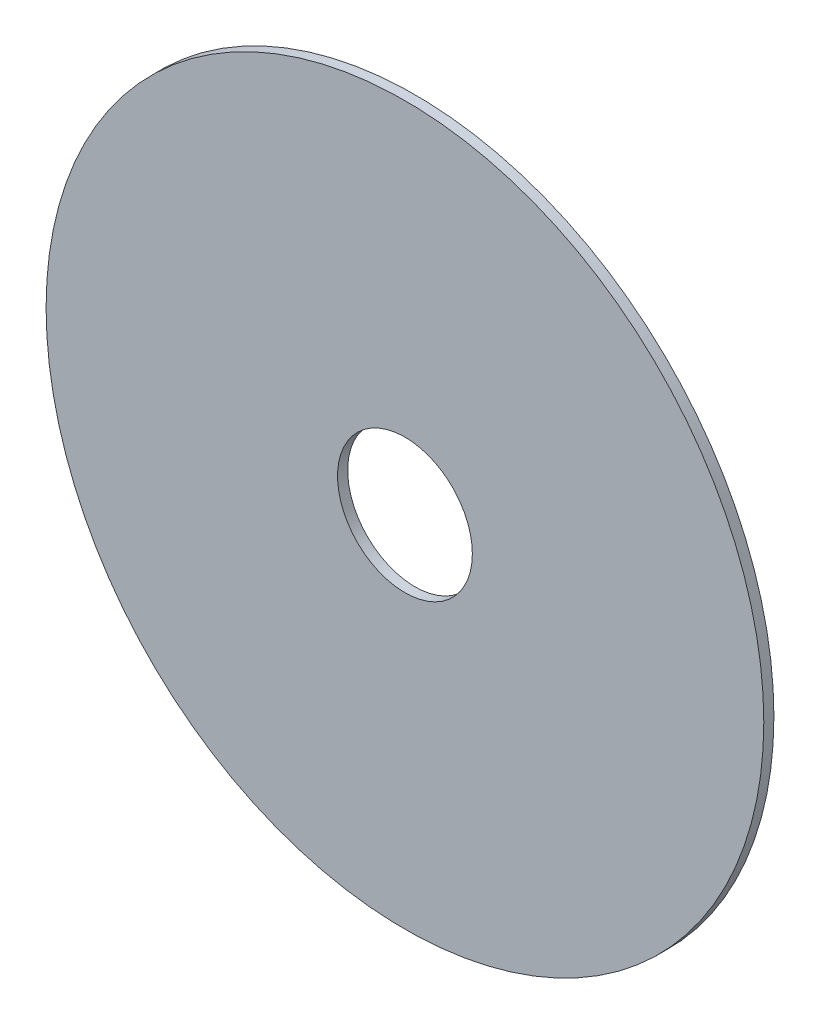
ISO-10303-21;
HEADER;
FILE_DESCRIPTION(('STEP AP214'),'2;1');
FILE_NAME('part.step','',(''),(''),'','','');
FILE_SCHEMA(('AUTOMOTIVE_DESIGN { 1 0 10303 214 1 1 1 1 }'));
ENDSEC;
DATA;
#1=APPLICATION_CONTEXT('core data for automotive mechanical design processes');
#2=APPLICATION_PROTOCOL_DEFINITION('international standard','automotive_design',2000,#1);
#3=PRODUCT_CONTEXT('',#1,'mechanical');
#4=PRODUCT('Part','Part','',(#3));
#5=PRODUCT_RELATED_PRODUCT_CATEGORY('part','',(#4));
#6=PRODUCT_DEFINITION_FORMATION('','',#4);
#7=PRODUCT_DEFINITION_CONTEXT('part definition',#1,'design');
#8=PRODUCT_DEFINITION('design','',#6,#7);
#9=PRODUCT_DEFINITION_SHAPE('','',#8);
#10=(LENGTH_UNIT() NAMED_UNIT(*) SI_UNIT(.MILLI.,.METRE.));
#11=(NAMED_UNIT(*) PLANE_ANGLE_UNIT() SI_UNIT($,.RADIAN.));
#12=(NAMED_UNIT(*) SI_UNIT($,.STERADIAN.) SOLID_ANGLE_UNIT());
#13=UNCERTAINTY_MEASURE_WITH_UNIT(LENGTH_MEASURE(1.E-05),#10,'distance_accuracy_value','');
#14=(GEOMETRIC_REPRESENTATION_CONTEXT(3) GLOBAL_UNCERTAINTY_ASSIGNED_CONTEXT((#13)) GLOBAL_UNIT_ASSIGNED_CONTEXT((#10,
#11,#12)) REPRESENTATION_CONTEXT('',''));
#15=CARTESIAN_POINT('',(0.,0.,0.));
#16=DIRECTION('',(0.,0.,1.));
#17=DIRECTION('',(1.,0.,0.));
#18=AXIS2_PLACEMENT_3D('',#15,#16,#17);
#19=CARTESIAN_POINT('',(0.,0.,3.));
#20=DIRECTION('',(0.,0.,1.));
#21=DIRECTION('',(1.,0.,0.));
#22=AXIS2_PLACEMENT_3D('',#19,#20,#21);
#23=PLANE('',#22);
#24=CARTESIAN_POINT('',(0.,0.,3.));
#25=DIRECTION('',(0.,0.,1.));
#26=DIRECTION('',(1.,0.,0.));
#27=AXIS2_PLACEMENT_3D('',#24,#25,#26);
#28=CIRCLE('',#27,106.5);
#29=CARTESIAN_POINT('',(106.5,0.,3.));
#30=VERTEX_POINT('',#29);
#31=EDGE_CURVE('E10',#30,#30,#28,.T.);
#32=ORIENTED_EDGE('',*,*,#31,.T.);
#33=EDGE_LOOP('',(#32));
#34=FACE_BOUND('',#33,.T.);
#35=CARTESIAN_POINT('',(0.,0.,3.));
#36=DIRECTION('',(0.,0.,1.));
#37=DIRECTION('',(1.,0.,0.));
#38=AXIS2_PLACEMENT_3D('',#35,#36,#37);
#39=CIRCLE('',#38,20.);
#40=CARTESIAN_POINT('',(20.,0.,3.));
#41=VERTEX_POINT('',#40);
#42=EDGE_CURVE('E56',#41,#41,#39,.T.);
#43=ORIENTED_EDGE('',*,*,#42,.F.);
#44=EDGE_LOOP('',(#43));
#45=FACE_BOUND('',#44,.T.);
#46=ADVANCED_FACE('F43',(#34,#45),#23,.T.);
#47=CARTESIAN_POINT('',(0.,0.,0.));
#48=DIRECTION('',(0.,0.,1.));
#49=DIRECTION('',(1.,0.,0.));
#50=AXIS2_PLACEMENT_3D('',#47,#48,#49);
#51=PLANE('',#50);
#52=CARTESIAN_POINT('',(0.,0.,0.));
#53=DIRECTION('',(0.,0.,1.));
#54=DIRECTION('',(1.,0.,0.));
#55=AXIS2_PLACEMENT_3D('',#52,#53,#54);
#56=CIRCLE('',#55,106.5);
#57=CARTESIAN_POINT('',(106.5,0.,0.));
#58=VERTEX_POINT('',#57);
#59=EDGE_CURVE('E47',#58,#58,#56,.T.);
#60=ORIENTED_EDGE('',*,*,#59,.F.);
#61=EDGE_LOOP('',(#60));
#62=FACE_BOUND('',#61,.T.);
#63=CARTESIAN_POINT('',(0.,0.,0.));
#64=DIRECTION('',(0.,0.,1.));
#65=DIRECTION('',(1.,0.,0.));
#66=AXIS2_PLACEMENT_3D('',#63,#64,#65);
#67=CIRCLE('',#66,20.);
#68=CARTESIAN_POINT('',(20.,0.,0.));
#69=VERTEX_POINT('',#68);
#70=EDGE_CURVE('E58',#69,#69,#67,.T.);
#71=ORIENTED_EDGE('',*,*,#70,.T.);
#72=EDGE_LOOP('',(#71));
#73=FACE_BOUND('',#72,.T.);
#74=ADVANCED_FACE('F70',(#62,#73),#51,.F.);
#75=CARTESIAN_POINT('',(0.,0.,3.));
#76=DIRECTION('',(0.,0.,-1.));
#77=DIRECTION('',(-1.,0.,0.));
#78=AXIS2_PLACEMENT_3D('',#75,#76,#77);
#79=CYLINDRICAL_SURFACE('',#78,106.5);
#80=ORIENTED_EDGE('',*,*,#31,.F.);
#81=EDGE_LOOP('',(#80));
#82=FACE_BOUND('',#81,.T.);
#83=ORIENTED_EDGE('',*,*,#59,.T.);
#84=EDGE_LOOP('',(#83));
#85=FACE_BOUND('',#84,.T.);
#86=ADVANCED_FACE('F45',(#82,#85),#79,.T.);
#87=CARTESIAN_POINT('',(0.,0.,3.));
#88=DIRECTION('',(0.,0.,-1.));
#89=DIRECTION('',(-1.,0.,0.));
#90=AXIS2_PLACEMENT_3D('',#87,#88,#89);
#91=CYLINDRICAL_SURFACE('',#90,20.);
#92=ORIENTED_EDGE('',*,*,#42,.T.);
#93=EDGE_LOOP('',(#92));
#94=FACE_BOUND('',#93,.T.);
#95=ORIENTED_EDGE('',*,*,#70,.F.);
#96=EDGE_LOOP('',(#95));
#97=FACE_BOUND('',#96,.T.);
#98=ADVANCED_FACE('F66',(#94,#97),#91,.F.);
#99=CLOSED_SHELL('',(#46,#74,#86,#98));
#100=MANIFOLD_SOLID_BREP('B2',#99);
#101=ADVANCED_BREP_SHAPE_REPRESENTATION('',(#18,#100),#14);
#102=SHAPE_DEFINITION_REPRESENTATION(#9,#101);
ENDSEC;
END-ISO-10303-21;
